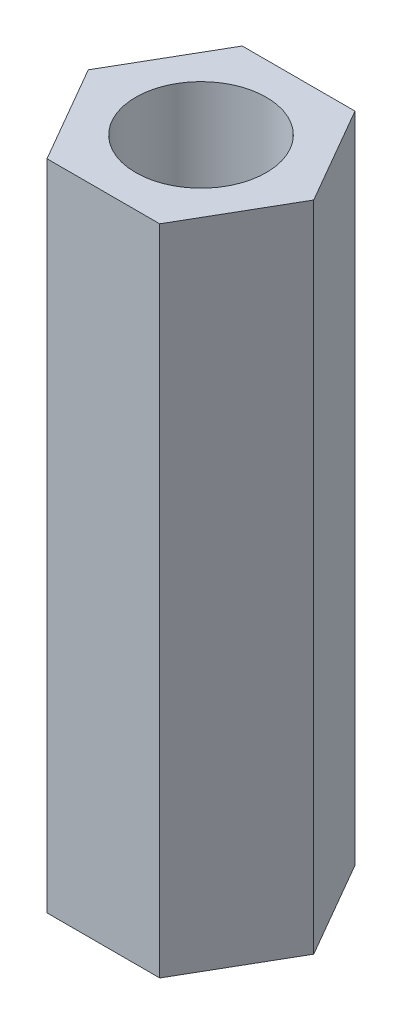
ISO-10303-21;
HEADER;
FILE_DESCRIPTION(('STEP AP214'),'2;1');
FILE_NAME('part.step','',(''),(''),'','','');
FILE_SCHEMA(('AUTOMOTIVE_DESIGN { 1 0 10303 214 1 1 1 1 }'));
ENDSEC;
DATA;
#1=APPLICATION_CONTEXT('core data for automotive mechanical design processes');
#2=APPLICATION_PROTOCOL_DEFINITION('international standard','automotive_design',2000,#1);
#3=PRODUCT_CONTEXT('',#1,'mechanical');
#4=PRODUCT('Part','Part','',(#3));
#5=PRODUCT_RELATED_PRODUCT_CATEGORY('part','',(#4));
#6=PRODUCT_DEFINITION_FORMATION('','',#4);
#7=PRODUCT_DEFINITION_CONTEXT('part definition',#1,'design');
#8=PRODUCT_DEFINITION('design','',#6,#7);
#9=PRODUCT_DEFINITION_SHAPE('','',#8);
#10=(LENGTH_UNIT() NAMED_UNIT(*) SI_UNIT(.MILLI.,.METRE.));
#11=(NAMED_UNIT(*) PLANE_ANGLE_UNIT() SI_UNIT($,.RADIAN.));
#12=(NAMED_UNIT(*) SI_UNIT($,.STERADIAN.) SOLID_ANGLE_UNIT());
#13=UNCERTAINTY_MEASURE_WITH_UNIT(LENGTH_MEASURE(1.E-05),#10,'distance_accuracy_value','');
#14=(GEOMETRIC_REPRESENTATION_CONTEXT(3) GLOBAL_UNCERTAINTY_ASSIGNED_CONTEXT((#13)) GLOBAL_UNIT_ASSIGNED_CONTEXT((#10,
#11,#12)) REPRESENTATION_CONTEXT('',''));
#15=CARTESIAN_POINT('',(0.,0.,0.));
#16=DIRECTION('',(0.,0.,1.));
#17=DIRECTION('',(1.,0.,0.));
#18=AXIS2_PLACEMENT_3D('',#15,#16,#17);
#19=CARTESIAN_POINT('',(0.,15.,0.));
#20=DIRECTION('',(0.,1.,0.));
#21=DIRECTION('',(0.,0.,1.));
#22=AXIS2_PLACEMENT_3D('',#19,#20,#21);
#23=PLANE('',#22);
#24=DIRECTION('',(-1.,0.,0.));
#25=VECTOR('',#24,1.);
#26=CARTESIAN_POINT('',(1.29456066259683,15.,-2.24224484109774));
#27=LINE('',#26,#25);
#28=CARTESIAN_POINT('',(1.29456066259683,15.,-2.24224484109774));
#29=VERTEX_POINT('',#28);
#30=CARTESIAN_POINT('',(-1.29456066259683,15.,-2.24224484109774));
#31=VERTEX_POINT('',#30);
#32=EDGE_CURVE('E129',#29,#31,#27,.T.);
#33=ORIENTED_EDGE('',*,*,#32,.T.);
#34=DIRECTION('',(-0.5,0.,0.866025403784439));
#35=VECTOR('',#34,1.);
#36=CARTESIAN_POINT('',(-1.29456066259683,15.,-2.24224484109774));
#37=LINE('',#36,#35);
#38=CARTESIAN_POINT('',(-2.58912132519366,15.,0.));
#39=VERTEX_POINT('',#38);
#40=EDGE_CURVE('E87',#31,#39,#37,.T.);
#41=ORIENTED_EDGE('',*,*,#40,.T.);
#42=DIRECTION('',(0.5,0.,0.866025403784439));
#43=VECTOR('',#42,1.);
#44=CARTESIAN_POINT('',(-2.58912132519366,15.,0.));
#45=LINE('',#44,#43);
#46=CARTESIAN_POINT('',(-1.29456066259683,15.,2.24224484109774));
#47=VERTEX_POINT('',#46);
#48=EDGE_CURVE('E100',#39,#47,#45,.T.);
#49=ORIENTED_EDGE('',*,*,#48,.T.);
#50=DIRECTION('',(1.,0.,0.));
#51=VECTOR('',#50,1.);
#52=CARTESIAN_POINT('',(-1.29456066259683,15.,2.24224484109774));
#53=LINE('',#52,#51);
#54=CARTESIAN_POINT('',(1.29456066259683,15.,2.24224484109774));
#55=VERTEX_POINT('',#54);
#56=EDGE_CURVE('E94',#47,#55,#53,.T.);
#57=ORIENTED_EDGE('',*,*,#56,.T.);
#58=DIRECTION('',(0.5,0.,-0.866025403784439));
#59=VECTOR('',#58,1.);
#60=CARTESIAN_POINT('',(1.29456066259683,15.,2.24224484109774));
#61=LINE('',#60,#59);
#62=CARTESIAN_POINT('',(2.58912132519366,15.,0.));
#63=VERTEX_POINT('',#62);
#64=EDGE_CURVE('E98',#55,#63,#61,.T.);
#65=ORIENTED_EDGE('',*,*,#64,.T.);
#66=DIRECTION('',(-0.5,0.,-0.866025403784439));
#67=VECTOR('',#66,1.);
#68=CARTESIAN_POINT('',(2.58912132519366,15.,0.));
#69=LINE('',#68,#67);
#70=EDGE_CURVE('E50',#63,#29,#69,.T.);
#71=ORIENTED_EDGE('',*,*,#70,.T.);
#72=EDGE_LOOP('',(#33,#41,#49,#57,#65,#71));
#73=FACE_BOUND('',#72,.T.);
#74=CARTESIAN_POINT('',(0.,15.,0.));
#75=DIRECTION('',(0.,1.,0.));
#76=DIRECTION('',(0.,0.,1.));
#77=AXIS2_PLACEMENT_3D('',#74,#75,#76);
#78=CIRCLE('',#77,1.5);
#79=CARTESIAN_POINT('',(0.,15.,1.5));
#80=VERTEX_POINT('',#79);
#81=EDGE_CURVE('E122',#80,#80,#78,.T.);
#82=ORIENTED_EDGE('',*,*,#81,.F.);
#83=EDGE_LOOP('',(#82));
#84=FACE_BOUND('',#83,.T.);
#85=ADVANCED_FACE('F33',(#73,#84),#23,.T.);
#86=CARTESIAN_POINT('',(0.,0.,0.));
#87=DIRECTION('',(0.,1.,0.));
#88=DIRECTION('',(0.,0.,1.));
#89=AXIS2_PLACEMENT_3D('',#86,#87,#88);
#90=PLANE('',#89);
#91=DIRECTION('',(-1.,0.,0.));
#92=VECTOR('',#91,1.);
#93=CARTESIAN_POINT('',(1.29456066259683,0.,-2.24224484109774));
#94=LINE('',#93,#92);
#95=CARTESIAN_POINT('',(1.29456066259683,0.,-2.24224484109774));
#96=VERTEX_POINT('',#95);
#97=CARTESIAN_POINT('',(-1.29456066259683,0.,-2.24224484109774));
#98=VERTEX_POINT('',#97);
#99=EDGE_CURVE('E118',#96,#98,#94,.T.);
#100=ORIENTED_EDGE('',*,*,#99,.F.);
#101=DIRECTION('',(-0.5,0.,-0.866025403784439));
#102=VECTOR('',#101,1.);
#103=CARTESIAN_POINT('',(2.58912132519366,0.,0.));
#104=LINE('',#103,#102);
#105=CARTESIAN_POINT('',(2.58912132519366,0.,0.));
#106=VERTEX_POINT('',#105);
#107=EDGE_CURVE('E79',#106,#96,#104,.T.);
#108=ORIENTED_EDGE('',*,*,#107,.F.);
#109=DIRECTION('',(0.5,0.,-0.866025403784439));
#110=VECTOR('',#109,1.);
#111=CARTESIAN_POINT('',(1.29456066259683,0.,2.24224484109774));
#112=LINE('',#111,#110);
#113=CARTESIAN_POINT('',(1.29456066259683,0.,2.24224484109774));
#114=VERTEX_POINT('',#113);
#115=EDGE_CURVE('E73',#114,#106,#112,.T.);
#116=ORIENTED_EDGE('',*,*,#115,.F.);
#117=DIRECTION('',(1.,0.,0.));
#118=VECTOR('',#117,1.);
#119=CARTESIAN_POINT('',(-1.29456066259683,0.,2.24224484109774));
#120=LINE('',#119,#118);
#121=CARTESIAN_POINT('',(-1.29456066259683,0.,2.24224484109774));
#122=VERTEX_POINT('',#121);
#123=EDGE_CURVE('E108',#122,#114,#120,.T.);
#124=ORIENTED_EDGE('',*,*,#123,.F.);
#125=DIRECTION('',(0.5,0.,0.866025403784439));
#126=VECTOR('',#125,1.);
#127=CARTESIAN_POINT('',(-2.58912132519366,0.,0.));
#128=LINE('',#127,#126);
#129=CARTESIAN_POINT('',(-2.58912132519366,0.,0.));
#130=VERTEX_POINT('',#129);
#131=EDGE_CURVE('E124',#130,#122,#128,.T.);
#132=ORIENTED_EDGE('',*,*,#131,.F.);
#133=DIRECTION('',(-0.5,0.,0.866025403784439));
#134=VECTOR('',#133,1.);
#135=CARTESIAN_POINT('',(-1.29456066259683,0.,-2.24224484109774));
#136=LINE('',#135,#134);
#137=EDGE_CURVE('E121',#98,#130,#136,.T.);
#138=ORIENTED_EDGE('',*,*,#137,.F.);
#139=EDGE_LOOP('',(#100,#108,#116,#124,#132,#138));
#140=FACE_BOUND('',#139,.T.);
#141=CARTESIAN_POINT('',(0.,0.,0.));
#142=DIRECTION('',(0.,1.,0.));
#143=DIRECTION('',(0.,0.,1.));
#144=AXIS2_PLACEMENT_3D('',#141,#142,#143);
#145=CIRCLE('',#144,1.5);
#146=CARTESIAN_POINT('',(0.,0.,1.5));
#147=VERTEX_POINT('',#146);
#148=EDGE_CURVE('E222',#147,#147,#145,.T.);
#149=ORIENTED_EDGE('',*,*,#148,.T.);
#150=EDGE_LOOP('',(#149));
#151=FACE_BOUND('',#150,.T.);
#152=ADVANCED_FACE('F138',(#140,#151),#90,.F.);
#153=CARTESIAN_POINT('',(1.29456066259683,15.,-2.24224484109774));
#154=DIRECTION('',(0.,0.,1.));
#155=DIRECTION('',(1.,0.,0.));
#156=AXIS2_PLACEMENT_3D('',#153,#154,#155);
#157=PLANE('',#156);
#158=ORIENTED_EDGE('',*,*,#99,.T.);
#159=DIRECTION('',(0.,-1.,0.));
#160=VECTOR('',#159,1.);
#161=CARTESIAN_POINT('',(-1.29456066259683,15.,-2.24224484109774));
#162=LINE('',#161,#160);
#163=EDGE_CURVE('E11',#31,#98,#162,.T.);
#164=ORIENTED_EDGE('',*,*,#163,.F.);
#165=ORIENTED_EDGE('',*,*,#32,.F.);
#166=DIRECTION('',(0.,-1.,0.));
#167=VECTOR('',#166,1.);
#168=CARTESIAN_POINT('',(1.29456066259683,15.,-2.24224484109774));
#169=LINE('',#168,#167);
#170=EDGE_CURVE('E114',#29,#96,#169,.T.);
#171=ORIENTED_EDGE('',*,*,#170,.T.);
#172=EDGE_LOOP('',(#158,#164,#165,#171));
#173=FACE_BOUND('',#172,.T.);
#174=ADVANCED_FACE('F35',(#173),#157,.F.);
#175=CARTESIAN_POINT('',(-1.29456066259683,15.,-2.24224484109774));
#176=DIRECTION('',(0.866025403784439,0.,0.5));
#177=DIRECTION('',(0.5,0.,-0.866025403784439));
#178=AXIS2_PLACEMENT_3D('',#175,#176,#177);
#179=PLANE('',#178);
#180=ORIENTED_EDGE('',*,*,#137,.T.);
#181=DIRECTION('',(0.,-1.,0.));
#182=VECTOR('',#181,1.);
#183=CARTESIAN_POINT('',(-2.58912132519366,15.,0.));
#184=LINE('',#183,#182);
#185=EDGE_CURVE('E42',#39,#130,#184,.T.);
#186=ORIENTED_EDGE('',*,*,#185,.F.);
#187=ORIENTED_EDGE('',*,*,#40,.F.);
#188=ORIENTED_EDGE('',*,*,#163,.T.);
#189=EDGE_LOOP('',(#180,#186,#187,#188));
#190=FACE_BOUND('',#189,.T.);
#191=ADVANCED_FACE('F163',(#190),#179,.F.);
#192=CARTESIAN_POINT('',(-2.58912132519366,15.,0.));
#193=DIRECTION('',(0.866025403784439,0.,-0.5));
#194=DIRECTION('',(-0.5,0.,-0.866025403784439));
#195=AXIS2_PLACEMENT_3D('',#192,#193,#194);
#196=PLANE('',#195);
#197=ORIENTED_EDGE('',*,*,#131,.T.);
#198=DIRECTION('',(0.,-1.,0.));
#199=VECTOR('',#198,1.);
#200=CARTESIAN_POINT('',(-1.29456066259683,15.,2.24224484109774));
#201=LINE('',#200,#199);
#202=EDGE_CURVE('E109',#47,#122,#201,.T.);
#203=ORIENTED_EDGE('',*,*,#202,.F.);
#204=ORIENTED_EDGE('',*,*,#48,.F.);
#205=ORIENTED_EDGE('',*,*,#185,.T.);
#206=EDGE_LOOP('',(#197,#203,#204,#205));
#207=FACE_BOUND('',#206,.T.);
#208=ADVANCED_FACE('F135',(#207),#196,.F.);
#209=CARTESIAN_POINT('',(-1.29456066259683,15.,2.24224484109774));
#210=DIRECTION('',(0.,0.,-1.));
#211=DIRECTION('',(-1.,0.,0.));
#212=AXIS2_PLACEMENT_3D('',#209,#210,#211);
#213=PLANE('',#212);
#214=ORIENTED_EDGE('',*,*,#123,.T.);
#215=DIRECTION('',(0.,-1.,0.));
#216=VECTOR('',#215,1.);
#217=CARTESIAN_POINT('',(1.29456066259683,15.,2.24224484109774));
#218=LINE('',#217,#216);
#219=EDGE_CURVE('E105',#55,#114,#218,.T.);
#220=ORIENTED_EDGE('',*,*,#219,.F.);
#221=ORIENTED_EDGE('',*,*,#56,.F.);
#222=ORIENTED_EDGE('',*,*,#202,.T.);
#223=EDGE_LOOP('',(#214,#220,#221,#222));
#224=FACE_BOUND('',#223,.T.);
#225=ADVANCED_FACE('F106',(#224),#213,.F.);
#226=CARTESIAN_POINT('',(1.29456066259683,15.,2.24224484109774));
#227=DIRECTION('',(-0.866025403784438,0.,-0.5));
#228=DIRECTION('',(-0.5,0.,0.866025403784439));
#229=AXIS2_PLACEMENT_3D('',#226,#227,#228);
#230=PLANE('',#229);
#231=ORIENTED_EDGE('',*,*,#115,.T.);
#232=DIRECTION('',(0.,-1.,0.));
#233=VECTOR('',#232,1.);
#234=CARTESIAN_POINT('',(2.58912132519366,15.,0.));
#235=LINE('',#234,#233);
#236=EDGE_CURVE('E110',#63,#106,#235,.T.);
#237=ORIENTED_EDGE('',*,*,#236,.F.);
#238=ORIENTED_EDGE('',*,*,#64,.F.);
#239=ORIENTED_EDGE('',*,*,#219,.T.);
#240=EDGE_LOOP('',(#231,#237,#238,#239));
#241=FACE_BOUND('',#240,.T.);
#242=ADVANCED_FACE('F112',(#241),#230,.F.);
#243=CARTESIAN_POINT('',(2.58912132519366,15.,0.));
#244=DIRECTION('',(-0.866025403784439,0.,0.5));
#245=DIRECTION('',(0.5,0.,0.866025403784439));
#246=AXIS2_PLACEMENT_3D('',#243,#244,#245);
#247=PLANE('',#246);
#248=ORIENTED_EDGE('',*,*,#107,.T.);
#249=ORIENTED_EDGE('',*,*,#170,.F.);
#250=ORIENTED_EDGE('',*,*,#70,.F.);
#251=ORIENTED_EDGE('',*,*,#236,.T.);
#252=EDGE_LOOP('',(#248,#249,#250,#251));
#253=FACE_BOUND('',#252,.T.);
#254=ADVANCED_FACE('F143',(#253),#247,.F.);
#255=CARTESIAN_POINT('',(0.,15.,0.));
#256=DIRECTION('',(0.,-1.,0.));
#257=DIRECTION('',(0.,0.,-1.));
#258=AXIS2_PLACEMENT_3D('',#255,#256,#257);
#259=CYLINDRICAL_SURFACE('',#258,1.5);
#260=ORIENTED_EDGE('',*,*,#81,.T.);
#261=EDGE_LOOP('',(#260));
#262=FACE_BOUND('',#261,.T.);
#263=ORIENTED_EDGE('',*,*,#148,.F.);
#264=EDGE_LOOP('',(#263));
#265=FACE_BOUND('',#264,.T.);
#266=ADVANCED_FACE('F145',(#262,#265),#259,.F.);
#267=CLOSED_SHELL('',(#85,#152,#174,#191,#208,#225,#242,#254,#266));
#268=MANIFOLD_SOLID_BREP('B2',#267);
#269=ADVANCED_BREP_SHAPE_REPRESENTATION('',(#18,#268),#14);
#270=SHAPE_DEFINITION_REPRESENTATION(#9,#269);
ENDSEC;
END-ISO-10303-21;
